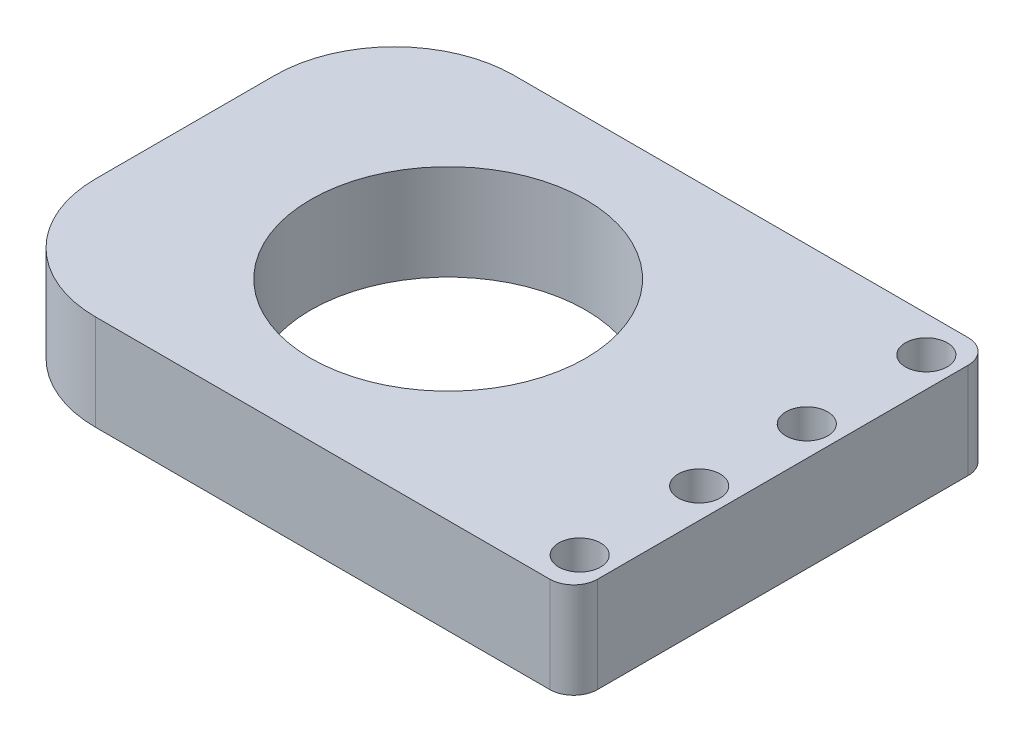
ISO-10303-21;
HEADER;
FILE_DESCRIPTION(('STEP AP214'),'2;1');
FILE_NAME('part.step','',(''),(''),'','','');
FILE_SCHEMA(('AUTOMOTIVE_DESIGN { 1 0 10303 214 1 1 1 1 }'));
ENDSEC;
DATA;
#1=APPLICATION_CONTEXT('core data for automotive mechanical design processes');
#2=APPLICATION_PROTOCOL_DEFINITION('international standard','automotive_design',2000,#1);
#3=PRODUCT_CONTEXT('',#1,'mechanical');
#4=PRODUCT('Part','Part','',(#3));
#5=PRODUCT_RELATED_PRODUCT_CATEGORY('part','',(#4));
#6=PRODUCT_DEFINITION_FORMATION('','',#4);
#7=PRODUCT_DEFINITION_CONTEXT('part definition',#1,'design');
#8=PRODUCT_DEFINITION('design','',#6,#7);
#9=PRODUCT_DEFINITION_SHAPE('','',#8);
#10=(LENGTH_UNIT() NAMED_UNIT(*) SI_UNIT(.MILLI.,.METRE.));
#11=(NAMED_UNIT(*) PLANE_ANGLE_UNIT() SI_UNIT($,.RADIAN.));
#12=(NAMED_UNIT(*) SI_UNIT($,.STERADIAN.) SOLID_ANGLE_UNIT());
#13=UNCERTAINTY_MEASURE_WITH_UNIT(LENGTH_MEASURE(1.E-05),#10,'distance_accuracy_value','');
#14=(GEOMETRIC_REPRESENTATION_CONTEXT(3) GLOBAL_UNCERTAINTY_ASSIGNED_CONTEXT((#13)) GLOBAL_UNIT_ASSIGNED_CONTEXT((#10,
#11,#12)) REPRESENTATION_CONTEXT('',''));
#15=CARTESIAN_POINT('',(0.,0.,0.));
#16=DIRECTION('',(0.,0.,1.));
#17=DIRECTION('',(1.,0.,0.));
#18=AXIS2_PLACEMENT_3D('',#15,#16,#17);
#19=CARTESIAN_POINT('',(0.,8.,0.));
#20=DIRECTION('',(0.,-1.,0.));
#21=DIRECTION('',(0.,0.,-1.));
#22=AXIS2_PLACEMENT_3D('',#19,#20,#21);
#23=PLANE('',#22);
#24=CARTESIAN_POINT('',(25.5,8.,-14.5));
#25=DIRECTION('',(0.,1.,0.));
#26=DIRECTION('',(0.,0.,1.));
#27=AXIS2_PLACEMENT_3D('',#24,#25,#26);
#28=CIRCLE('',#27,1.75);
#29=CARTESIAN_POINT('',(25.5,8.,-12.75));
#30=VERTEX_POINT('',#29);
#31=EDGE_CURVE('E238',#30,#30,#28,.T.);
#32=ORIENTED_EDGE('',*,*,#31,.F.);
#33=EDGE_LOOP('',(#32));
#34=FACE_BOUND('',#33,.T.);
#35=CARTESIAN_POINT('',(25.5,8.,14.5));
#36=DIRECTION('',(0.,1.,0.));
#37=DIRECTION('',(0.,0.,1.));
#38=AXIS2_PLACEMENT_3D('',#35,#36,#37);
#39=CIRCLE('',#38,1.75);
#40=CARTESIAN_POINT('',(25.5,8.,16.25));
#41=VERTEX_POINT('',#40);
#42=EDGE_CURVE('E244',#41,#41,#39,.T.);
#43=ORIENTED_EDGE('',*,*,#42,.F.);
#44=EDGE_LOOP('',(#43));
#45=FACE_BOUND('',#44,.T.);
#46=CARTESIAN_POINT('',(25.5,8.,4.5));
#47=DIRECTION('',(0.,1.,0.));
#48=DIRECTION('',(0.,0.,1.));
#49=AXIS2_PLACEMENT_3D('',#46,#47,#48);
#50=CIRCLE('',#49,1.75);
#51=CARTESIAN_POINT('',(25.5,8.,6.25));
#52=VERTEX_POINT('',#51);
#53=EDGE_CURVE('E233',#52,#52,#50,.T.);
#54=ORIENTED_EDGE('',*,*,#53,.F.);
#55=EDGE_LOOP('',(#54));
#56=FACE_BOUND('',#55,.T.);
#57=CARTESIAN_POINT('',(25.5,8.,-4.5));
#58=DIRECTION('',(0.,1.,0.));
#59=DIRECTION('',(0.,0.,1.));
#60=AXIS2_PLACEMENT_3D('',#57,#58,#59);
#61=CIRCLE('',#60,1.75);
#62=CARTESIAN_POINT('',(25.5,8.,-2.75));
#63=VERTEX_POINT('',#62);
#64=EDGE_CURVE('E217',#63,#63,#61,.T.);
#65=ORIENTED_EDGE('',*,*,#64,.F.);
#66=EDGE_LOOP('',(#65));
#67=FACE_BOUND('',#66,.T.);
#68=DIRECTION('',(1.,0.,0.));
#69=VECTOR('',#68,1.);
#70=CARTESIAN_POINT('',(28.,8.,17.5));
#71=LINE('',#70,#69);
#72=CARTESIAN_POINT('',(-12.,8.,17.5));
#73=VERTEX_POINT('',#72);
#74=CARTESIAN_POINT('',(26.,8.,17.5));
#75=VERTEX_POINT('',#74);
#76=EDGE_CURVE('E116',#73,#75,#71,.T.);
#77=ORIENTED_EDGE('',*,*,#76,.T.);
#78=CARTESIAN_POINT('',(26.,8.,15.5));
#79=DIRECTION('',(0.,-1.,0.));
#80=DIRECTION('',(0.,0.,-1.));
#81=AXIS2_PLACEMENT_3D('',#78,#79,#80);
#82=CIRCLE('',#81,2.);
#83=CARTESIAN_POINT('',(28.,8.,15.5));
#84=VERTEX_POINT('',#83);
#85=EDGE_CURVE('E41',#75,#84,#82,.F.);
#86=ORIENTED_EDGE('',*,*,#85,.T.);
#87=DIRECTION('',(0.,0.,-1.));
#88=VECTOR('',#87,1.);
#89=CARTESIAN_POINT('',(28.,8.,-17.5));
#90=LINE('',#89,#88);
#91=CARTESIAN_POINT('',(28.,8.,-15.5));
#92=VERTEX_POINT('',#91);
#93=EDGE_CURVE('E122',#84,#92,#90,.T.);
#94=ORIENTED_EDGE('',*,*,#93,.T.);
#95=CARTESIAN_POINT('',(26.,8.,-15.5));
#96=DIRECTION('',(0.,-1.,0.));
#97=DIRECTION('',(0.,0.,-1.));
#98=AXIS2_PLACEMENT_3D('',#95,#96,#97);
#99=CIRCLE('',#98,2.);
#100=CARTESIAN_POINT('',(26.,8.,-17.5));
#101=VERTEX_POINT('',#100);
#102=EDGE_CURVE('E48',#92,#101,#99,.F.);
#103=ORIENTED_EDGE('',*,*,#102,.T.);
#104=DIRECTION('',(-1.,0.,0.));
#105=VECTOR('',#104,1.);
#106=CARTESIAN_POINT('',(28.,8.,-17.5));
#107=LINE('',#106,#105);
#108=CARTESIAN_POINT('',(-12.,8.,-17.5));
#109=VERTEX_POINT('',#108);
#110=EDGE_CURVE('E125',#101,#109,#107,.T.);
#111=ORIENTED_EDGE('',*,*,#110,.T.);
#112=CARTESIAN_POINT('',(-12.,8.,-7.5));
#113=DIRECTION('',(0.,-1.,0.));
#114=DIRECTION('',(0.,0.,-1.));
#115=AXIS2_PLACEMENT_3D('',#112,#113,#114);
#116=CIRCLE('',#115,10.);
#117=CARTESIAN_POINT('',(-22.,8.,-7.5));
#118=VERTEX_POINT('',#117);
#119=EDGE_CURVE('E136',#109,#118,#116,.F.);
#120=ORIENTED_EDGE('',*,*,#119,.T.);
#121=DIRECTION('',(0.,0.,1.));
#122=VECTOR('',#121,1.);
#123=CARTESIAN_POINT('',(-22.,8.,-17.5));
#124=LINE('',#123,#122);
#125=CARTESIAN_POINT('',(-22.,8.,7.5));
#126=VERTEX_POINT('',#125);
#127=EDGE_CURVE('E222',#118,#126,#124,.T.);
#128=ORIENTED_EDGE('',*,*,#127,.T.);
#129=CARTESIAN_POINT('',(-12.,8.,7.5));
#130=DIRECTION('',(0.,-1.,0.));
#131=DIRECTION('',(0.,0.,-1.));
#132=AXIS2_PLACEMENT_3D('',#129,#130,#131);
#133=CIRCLE('',#132,10.);
#134=EDGE_CURVE('E138',#126,#73,#133,.F.);
#135=ORIENTED_EDGE('',*,*,#134,.T.);
#136=EDGE_LOOP('',(#77,#86,#94,#103,#111,#120,#128,#135));
#137=FACE_BOUND('',#136,.T.);
#138=CARTESIAN_POINT('',(0.,8.,0.));
#139=DIRECTION('',(0.,1.,0.));
#140=DIRECTION('',(0.,0.,1.));
#141=AXIS2_PLACEMENT_3D('',#138,#139,#140);
#142=CIRCLE('',#141,11.5);
#143=CARTESIAN_POINT('',(0.,8.,11.5));
#144=VERTEX_POINT('',#143);
#145=EDGE_CURVE('E208',#144,#144,#142,.T.);
#146=ORIENTED_EDGE('',*,*,#145,.F.);
#147=EDGE_LOOP('',(#146));
#148=FACE_BOUND('',#147,.T.);
#149=ADVANCED_FACE('F33',(#34,#45,#56,#67,#137,#148),#23,.F.);
#150=CARTESIAN_POINT('',(0.,0.,0.));
#151=DIRECTION('',(0.,-1.,0.));
#152=DIRECTION('',(0.,0.,-1.));
#153=AXIS2_PLACEMENT_3D('',#150,#151,#152);
#154=PLANE('',#153);
#155=CARTESIAN_POINT('',(25.5,0.,-14.5));
#156=DIRECTION('',(0.,1.,0.));
#157=DIRECTION('',(0.,0.,1.));
#158=AXIS2_PLACEMENT_3D('',#155,#156,#157);
#159=CIRCLE('',#158,1.75);
#160=CARTESIAN_POINT('',(25.5,0.,-12.75));
#161=VERTEX_POINT('',#160);
#162=EDGE_CURVE('E235',#161,#161,#159,.T.);
#163=ORIENTED_EDGE('',*,*,#162,.T.);
#164=EDGE_LOOP('',(#163));
#165=FACE_BOUND('',#164,.T.);
#166=CARTESIAN_POINT('',(25.5,0.,14.5));
#167=DIRECTION('',(0.,1.,0.));
#168=DIRECTION('',(0.,0.,1.));
#169=AXIS2_PLACEMENT_3D('',#166,#167,#168);
#170=CIRCLE('',#169,1.75);
#171=CARTESIAN_POINT('',(25.5,0.,16.25));
#172=VERTEX_POINT('',#171);
#173=EDGE_CURVE('E241',#172,#172,#170,.T.);
#174=ORIENTED_EDGE('',*,*,#173,.T.);
#175=EDGE_LOOP('',(#174));
#176=FACE_BOUND('',#175,.T.);
#177=CARTESIAN_POINT('',(25.5,0.,4.5));
#178=DIRECTION('',(0.,1.,0.));
#179=DIRECTION('',(0.,0.,1.));
#180=AXIS2_PLACEMENT_3D('',#177,#178,#179);
#181=CIRCLE('',#180,1.75);
#182=CARTESIAN_POINT('',(25.5,0.,6.25));
#183=VERTEX_POINT('',#182);
#184=EDGE_CURVE('E247',#183,#183,#181,.T.);
#185=ORIENTED_EDGE('',*,*,#184,.T.);
#186=EDGE_LOOP('',(#185));
#187=FACE_BOUND('',#186,.T.);
#188=CARTESIAN_POINT('',(25.5,0.,-4.5));
#189=DIRECTION('',(0.,1.,0.));
#190=DIRECTION('',(0.,0.,1.));
#191=AXIS2_PLACEMENT_3D('',#188,#189,#190);
#192=CIRCLE('',#191,1.75);
#193=CARTESIAN_POINT('',(25.5,0.,-2.75));
#194=VERTEX_POINT('',#193);
#195=EDGE_CURVE('E212',#194,#194,#192,.T.);
#196=ORIENTED_EDGE('',*,*,#195,.T.);
#197=EDGE_LOOP('',(#196));
#198=FACE_BOUND('',#197,.T.);
#199=DIRECTION('',(0.,0.,-1.));
#200=VECTOR('',#199,1.);
#201=CARTESIAN_POINT('',(28.,0.,-17.5));
#202=LINE('',#201,#200);
#203=CARTESIAN_POINT('',(28.,0.,15.5));
#204=VERTEX_POINT('',#203);
#205=CARTESIAN_POINT('',(28.,0.,-15.5));
#206=VERTEX_POINT('',#205);
#207=EDGE_CURVE('E214',#204,#206,#202,.T.);
#208=ORIENTED_EDGE('',*,*,#207,.F.);
#209=CARTESIAN_POINT('',(26.,0.,15.5));
#210=DIRECTION('',(0.,-1.,0.));
#211=DIRECTION('',(0.,0.,-1.));
#212=AXIS2_PLACEMENT_3D('',#209,#210,#211);
#213=CIRCLE('',#212,2.);
#214=CARTESIAN_POINT('',(26.,0.,17.5));
#215=VERTEX_POINT('',#214);
#216=EDGE_CURVE('E121',#204,#215,#213,.T.);
#217=ORIENTED_EDGE('',*,*,#216,.T.);
#218=DIRECTION('',(1.,0.,0.));
#219=VECTOR('',#218,1.);
#220=CARTESIAN_POINT('',(28.,0.,17.5));
#221=LINE('',#220,#219);
#222=CARTESIAN_POINT('',(-12.,0.,17.5));
#223=VERTEX_POINT('',#222);
#224=EDGE_CURVE('E115',#223,#215,#221,.T.);
#225=ORIENTED_EDGE('',*,*,#224,.F.);
#226=CARTESIAN_POINT('',(-12.,0.,7.5));
#227=DIRECTION('',(0.,-1.,0.));
#228=DIRECTION('',(0.,0.,-1.));
#229=AXIS2_PLACEMENT_3D('',#226,#227,#228);
#230=CIRCLE('',#229,10.);
#231=CARTESIAN_POINT('',(-22.,0.,7.5));
#232=VERTEX_POINT('',#231);
#233=EDGE_CURVE('E101',#223,#232,#230,.T.);
#234=ORIENTED_EDGE('',*,*,#233,.T.);
#235=DIRECTION('',(0.,0.,1.));
#236=VECTOR('',#235,1.);
#237=CARTESIAN_POINT('',(-22.,0.,-17.5));
#238=LINE('',#237,#236);
#239=CARTESIAN_POINT('',(-22.,0.,-7.5));
#240=VERTEX_POINT('',#239);
#241=EDGE_CURVE('E123',#240,#232,#238,.T.);
#242=ORIENTED_EDGE('',*,*,#241,.F.);
#243=CARTESIAN_POINT('',(-12.,0.,-7.5));
#244=DIRECTION('',(0.,-1.,0.));
#245=DIRECTION('',(0.,0.,-1.));
#246=AXIS2_PLACEMENT_3D('',#243,#244,#245);
#247=CIRCLE('',#246,10.);
#248=CARTESIAN_POINT('',(-12.,0.,-17.5));
#249=VERTEX_POINT('',#248);
#250=EDGE_CURVE('E112',#240,#249,#247,.T.);
#251=ORIENTED_EDGE('',*,*,#250,.T.);
#252=DIRECTION('',(-1.,0.,0.));
#253=VECTOR('',#252,1.);
#254=CARTESIAN_POINT('',(28.,0.,-17.5));
#255=LINE('',#254,#253);
#256=CARTESIAN_POINT('',(26.,0.,-17.5));
#257=VERTEX_POINT('',#256);
#258=EDGE_CURVE('E127',#257,#249,#255,.T.);
#259=ORIENTED_EDGE('',*,*,#258,.F.);
#260=CARTESIAN_POINT('',(26.,0.,-15.5));
#261=DIRECTION('',(0.,-1.,0.));
#262=DIRECTION('',(0.,0.,-1.));
#263=AXIS2_PLACEMENT_3D('',#260,#261,#262);
#264=CIRCLE('',#263,2.);
#265=EDGE_CURVE('E148',#257,#206,#264,.T.);
#266=ORIENTED_EDGE('',*,*,#265,.T.);
#267=EDGE_LOOP('',(#208,#217,#225,#234,#242,#251,#259,#266));
#268=FACE_BOUND('',#267,.T.);
#269=CARTESIAN_POINT('',(0.,0.,0.));
#270=DIRECTION('',(0.,1.,0.));
#271=DIRECTION('',(0.,0.,1.));
#272=AXIS2_PLACEMENT_3D('',#269,#270,#271);
#273=CIRCLE('',#272,11.5);
#274=CARTESIAN_POINT('',(0.,0.,11.5));
#275=VERTEX_POINT('',#274);
#276=EDGE_CURVE('E211',#275,#275,#273,.T.);
#277=ORIENTED_EDGE('',*,*,#276,.T.);
#278=EDGE_LOOP('',(#277));
#279=FACE_BOUND('',#278,.T.);
#280=ADVANCED_FACE('F119',(#165,#176,#187,#198,#268,#279),#154,.T.);
#281=CARTESIAN_POINT('',(28.,8.,-17.5));
#282=DIRECTION('',(-1.,0.,0.));
#283=DIRECTION('',(0.,0.,1.));
#284=AXIS2_PLACEMENT_3D('',#281,#282,#283);
#285=PLANE('',#284);
#286=ORIENTED_EDGE('',*,*,#93,.F.);
#287=DIRECTION('',(0.,-1.,0.));
#288=VECTOR('',#287,1.);
#289=CARTESIAN_POINT('',(28.,8.,15.5));
#290=LINE('',#289,#288);
#291=EDGE_CURVE('E145',#84,#204,#290,.T.);
#292=ORIENTED_EDGE('',*,*,#291,.T.);
#293=ORIENTED_EDGE('',*,*,#207,.T.);
#294=DIRECTION('',(0.,-1.,0.));
#295=VECTOR('',#294,1.);
#296=CARTESIAN_POINT('',(28.,8.,-15.5));
#297=LINE('',#296,#295);
#298=EDGE_CURVE('E143',#206,#92,#297,.F.);
#299=ORIENTED_EDGE('',*,*,#298,.T.);
#300=EDGE_LOOP('',(#286,#292,#293,#299));
#301=FACE_BOUND('',#300,.T.);
#302=ADVANCED_FACE('F158',(#301),#285,.F.);
#303=CARTESIAN_POINT('',(28.,8.,-17.5));
#304=DIRECTION('',(0.,0.,1.));
#305=DIRECTION('',(1.,0.,0.));
#306=AXIS2_PLACEMENT_3D('',#303,#304,#305);
#307=PLANE('',#306);
#308=ORIENTED_EDGE('',*,*,#110,.F.);
#309=DIRECTION('',(0.,-1.,0.));
#310=VECTOR('',#309,1.);
#311=CARTESIAN_POINT('',(26.,8.,-17.5));
#312=LINE('',#311,#310);
#313=EDGE_CURVE('E11',#101,#257,#312,.T.);
#314=ORIENTED_EDGE('',*,*,#313,.T.);
#315=ORIENTED_EDGE('',*,*,#258,.T.);
#316=DIRECTION('',(0.,-1.,0.));
#317=VECTOR('',#316,1.);
#318=CARTESIAN_POINT('',(-12.,8.,-17.5));
#319=LINE('',#318,#317);
#320=EDGE_CURVE('E140',#249,#109,#319,.F.);
#321=ORIENTED_EDGE('',*,*,#320,.T.);
#322=EDGE_LOOP('',(#308,#314,#315,#321));
#323=FACE_BOUND('',#322,.T.);
#324=ADVANCED_FACE('F191',(#323),#307,.F.);
#325=CARTESIAN_POINT('',(-22.,8.,-17.5));
#326=DIRECTION('',(1.,0.,0.));
#327=DIRECTION('',(0.,0.,-1.));
#328=AXIS2_PLACEMENT_3D('',#325,#326,#327);
#329=PLANE('',#328);
#330=ORIENTED_EDGE('',*,*,#241,.T.);
#331=DIRECTION('',(0.,-1.,0.));
#332=VECTOR('',#331,1.);
#333=CARTESIAN_POINT('',(-22.,8.,7.5));
#334=LINE('',#333,#332);
#335=EDGE_CURVE('E106',#232,#126,#334,.F.);
#336=ORIENTED_EDGE('',*,*,#335,.T.);
#337=ORIENTED_EDGE('',*,*,#127,.F.);
#338=DIRECTION('',(0.,-1.,0.));
#339=VECTOR('',#338,1.);
#340=CARTESIAN_POINT('',(-22.,8.,-7.5));
#341=LINE('',#340,#339);
#342=EDGE_CURVE('E111',#118,#240,#341,.T.);
#343=ORIENTED_EDGE('',*,*,#342,.T.);
#344=EDGE_LOOP('',(#330,#336,#337,#343));
#345=FACE_BOUND('',#344,.T.);
#346=ADVANCED_FACE('F188',(#345),#329,.F.);
#347=CARTESIAN_POINT('',(28.,8.,17.5));
#348=DIRECTION('',(0.,0.,-1.));
#349=DIRECTION('',(-1.,0.,0.));
#350=AXIS2_PLACEMENT_3D('',#347,#348,#349);
#351=PLANE('',#350);
#352=ORIENTED_EDGE('',*,*,#224,.T.);
#353=DIRECTION('',(0.,-1.,0.));
#354=VECTOR('',#353,1.);
#355=CARTESIAN_POINT('',(26.,8.,17.5));
#356=LINE('',#355,#354);
#357=EDGE_CURVE('E56',#215,#75,#356,.F.);
#358=ORIENTED_EDGE('',*,*,#357,.T.);
#359=ORIENTED_EDGE('',*,*,#76,.F.);
#360=DIRECTION('',(0.,-1.,0.));
#361=VECTOR('',#360,1.);
#362=CARTESIAN_POINT('',(-12.,8.,17.5));
#363=LINE('',#362,#361);
#364=EDGE_CURVE('E105',#73,#223,#363,.T.);
#365=ORIENTED_EDGE('',*,*,#364,.T.);
#366=EDGE_LOOP('',(#352,#358,#359,#365));
#367=FACE_BOUND('',#366,.T.);
#368=ADVANCED_FACE('F114',(#367),#351,.F.);
#369=CARTESIAN_POINT('',(0.,8.,0.));
#370=DIRECTION('',(0.,-1.,0.));
#371=DIRECTION('',(0.,0.,-1.));
#372=AXIS2_PLACEMENT_3D('',#369,#370,#371);
#373=CYLINDRICAL_SURFACE('',#372,11.5);
#374=ORIENTED_EDGE('',*,*,#145,.T.);
#375=EDGE_LOOP('',(#374));
#376=FACE_BOUND('',#375,.T.);
#377=ORIENTED_EDGE('',*,*,#276,.F.);
#378=EDGE_LOOP('',(#377));
#379=FACE_BOUND('',#378,.T.);
#380=ADVANCED_FACE('F183',(#376,#379),#373,.F.);
#381=CARTESIAN_POINT('',(-12.,8.,7.5));
#382=DIRECTION('',(0.,-1.,0.));
#383=DIRECTION('',(0.,0.,-1.));
#384=AXIS2_PLACEMENT_3D('',#381,#382,#383);
#385=CYLINDRICAL_SURFACE('',#384,10.);
#386=ORIENTED_EDGE('',*,*,#134,.F.);
#387=ORIENTED_EDGE('',*,*,#335,.F.);
#388=ORIENTED_EDGE('',*,*,#233,.F.);
#389=ORIENTED_EDGE('',*,*,#364,.F.);
#390=EDGE_LOOP('',(#386,#387,#388,#389));
#391=FACE_BOUND('',#390,.T.);
#392=ADVANCED_FACE('F104',(#391),#385,.T.);
#393=CARTESIAN_POINT('',(-12.,8.,-7.5));
#394=DIRECTION('',(0.,-1.,0.));
#395=DIRECTION('',(0.,0.,-1.));
#396=AXIS2_PLACEMENT_3D('',#393,#394,#395);
#397=CYLINDRICAL_SURFACE('',#396,10.);
#398=ORIENTED_EDGE('',*,*,#119,.F.);
#399=ORIENTED_EDGE('',*,*,#320,.F.);
#400=ORIENTED_EDGE('',*,*,#250,.F.);
#401=ORIENTED_EDGE('',*,*,#342,.F.);
#402=EDGE_LOOP('',(#398,#399,#400,#401));
#403=FACE_BOUND('',#402,.T.);
#404=ADVANCED_FACE('F163',(#403),#397,.T.);
#405=CARTESIAN_POINT('',(26.,8.,15.5));
#406=DIRECTION('',(0.,-1.,0.));
#407=DIRECTION('',(0.,0.,-1.));
#408=AXIS2_PLACEMENT_3D('',#405,#406,#407);
#409=CYLINDRICAL_SURFACE('',#408,2.);
#410=ORIENTED_EDGE('',*,*,#85,.F.);
#411=ORIENTED_EDGE('',*,*,#357,.F.);
#412=ORIENTED_EDGE('',*,*,#216,.F.);
#413=ORIENTED_EDGE('',*,*,#291,.F.);
#414=EDGE_LOOP('',(#410,#411,#412,#413));
#415=FACE_BOUND('',#414,.T.);
#416=ADVANCED_FACE('F161',(#415),#409,.T.);
#417=CARTESIAN_POINT('',(26.,8.,-15.5));
#418=DIRECTION('',(0.,-1.,0.));
#419=DIRECTION('',(0.,0.,-1.));
#420=AXIS2_PLACEMENT_3D('',#417,#418,#419);
#421=CYLINDRICAL_SURFACE('',#420,2.);
#422=ORIENTED_EDGE('',*,*,#102,.F.);
#423=ORIENTED_EDGE('',*,*,#298,.F.);
#424=ORIENTED_EDGE('',*,*,#265,.F.);
#425=ORIENTED_EDGE('',*,*,#313,.F.);
#426=EDGE_LOOP('',(#422,#423,#424,#425));
#427=FACE_BOUND('',#426,.T.);
#428=ADVANCED_FACE('F35',(#427),#421,.T.);
#429=CARTESIAN_POINT('',(25.5,0.,-4.5));
#430=DIRECTION('',(0.,1.,0.));
#431=DIRECTION('',(0.,0.,1.));
#432=AXIS2_PLACEMENT_3D('',#429,#430,#431);
#433=CYLINDRICAL_SURFACE('',#432,1.75);
#434=ORIENTED_EDGE('',*,*,#195,.F.);
#435=EDGE_LOOP('',(#434));
#436=FACE_BOUND('',#435,.T.);
#437=ORIENTED_EDGE('',*,*,#64,.T.);
#438=EDGE_LOOP('',(#437));
#439=FACE_BOUND('',#438,.T.);
#440=ADVANCED_FACE('F168',(#436,#439),#433,.F.);
#441=CARTESIAN_POINT('',(25.5,0.,4.5));
#442=DIRECTION('',(0.,1.,0.));
#443=DIRECTION('',(0.,0.,1.));
#444=AXIS2_PLACEMENT_3D('',#441,#442,#443);
#445=CYLINDRICAL_SURFACE('',#444,1.75);
#446=ORIENTED_EDGE('',*,*,#184,.F.);
#447=EDGE_LOOP('',(#446));
#448=FACE_BOUND('',#447,.T.);
#449=ORIENTED_EDGE('',*,*,#53,.T.);
#450=EDGE_LOOP('',(#449));
#451=FACE_BOUND('',#450,.T.);
#452=ADVANCED_FACE('F253',(#448,#451),#445,.F.);
#453=CARTESIAN_POINT('',(25.5,0.,14.5));
#454=DIRECTION('',(0.,1.,0.));
#455=DIRECTION('',(0.,0.,1.));
#456=AXIS2_PLACEMENT_3D('',#453,#454,#455);
#457=CYLINDRICAL_SURFACE('',#456,1.75);
#458=ORIENTED_EDGE('',*,*,#173,.F.);
#459=EDGE_LOOP('',(#458));
#460=FACE_BOUND('',#459,.T.);
#461=ORIENTED_EDGE('',*,*,#42,.T.);
#462=EDGE_LOOP('',(#461));
#463=FACE_BOUND('',#462,.T.);
#464=ADVANCED_FACE('F263',(#460,#463),#457,.F.);
#465=CARTESIAN_POINT('',(25.5,0.,-14.5));
#466=DIRECTION('',(0.,1.,0.));
#467=DIRECTION('',(0.,0.,1.));
#468=AXIS2_PLACEMENT_3D('',#465,#466,#467);
#469=CYLINDRICAL_SURFACE('',#468,1.75);
#470=ORIENTED_EDGE('',*,*,#162,.F.);
#471=EDGE_LOOP('',(#470));
#472=FACE_BOUND('',#471,.T.);
#473=ORIENTED_EDGE('',*,*,#31,.T.);
#474=EDGE_LOOP('',(#473));
#475=FACE_BOUND('',#474,.T.);
#476=ADVANCED_FACE('F268',(#472,#475),#469,.F.);
#477=CLOSED_SHELL('',(#149,#280,#302,#324,#346,#368,#380,#392,#404,#416,#428,#440,#452,#464,#476));
#478=MANIFOLD_SOLID_BREP('B2',#477);
#479=ADVANCED_BREP_SHAPE_REPRESENTATION('',(#18,#478),#14);
#480=SHAPE_DEFINITION_REPRESENTATION(#9,#479);
ENDSEC;
END-ISO-10303-21;
